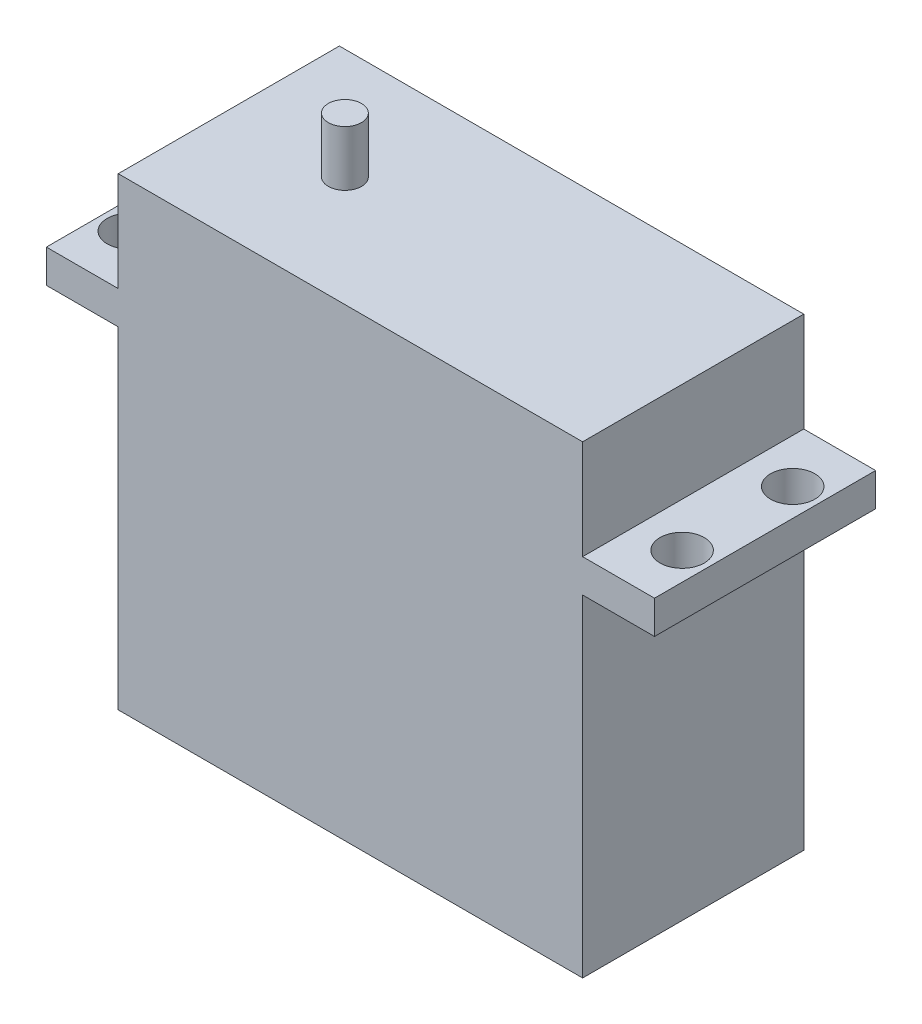
ISO-10303-21;
HEADER;
FILE_DESCRIPTION(('STEP AP214'),'2;1');
FILE_NAME('part.step','',(''),(''),'','','');
FILE_SCHEMA(('AUTOMOTIVE_DESIGN { 1 0 10303 214 1 1 1 1 }'));
ENDSEC;
DATA;
#1=APPLICATION_CONTEXT('core data for automotive mechanical design processes');
#2=APPLICATION_PROTOCOL_DEFINITION('international standard','automotive_design',2000,#1);
#3=PRODUCT_CONTEXT('',#1,'mechanical');
#4=PRODUCT('Part','Part','',(#3));
#5=PRODUCT_RELATED_PRODUCT_CATEGORY('part','',(#4));
#6=PRODUCT_DEFINITION_FORMATION('','',#4);
#7=PRODUCT_DEFINITION_CONTEXT('part definition',#1,'design');
#8=PRODUCT_DEFINITION('design','',#6,#7);
#9=PRODUCT_DEFINITION_SHAPE('','',#8);
#10=(LENGTH_UNIT() NAMED_UNIT(*) SI_UNIT(.MILLI.,.METRE.));
#11=(NAMED_UNIT(*) PLANE_ANGLE_UNIT() SI_UNIT($,.RADIAN.));
#12=(NAMED_UNIT(*) SI_UNIT($,.STERADIAN.) SOLID_ANGLE_UNIT());
#13=UNCERTAINTY_MEASURE_WITH_UNIT(LENGTH_MEASURE(1.E-05),#10,'distance_accuracy_value','');
#14=(GEOMETRIC_REPRESENTATION_CONTEXT(3) GLOBAL_UNCERTAINTY_ASSIGNED_CONTEXT((#13)) GLOBAL_UNIT_ASSIGNED_CONTEXT((#10,
#11,#12)) REPRESENTATION_CONTEXT('',''));
#15=CARTESIAN_POINT('',(0.,0.,0.));
#16=DIRECTION('',(0.,0.,1.));
#17=DIRECTION('',(1.,0.,0.));
#18=AXIS2_PLACEMENT_3D('',#15,#16,#17);
#19=CARTESIAN_POINT('',(48.4999999999999,0.,0.));
#20=DIRECTION('',(1.,0.,0.));
#21=DIRECTION('',(0.,1.,0.));
#22=AXIS2_PLACEMENT_3D('',#19,#20,#21);
#23=PLANE('',#22);
#24=DIRECTION('',(0.,0.,-1.));
#25=VECTOR('',#24,1.);
#26=CARTESIAN_POINT('',(48.5,33.,20.));
#27=LINE('',#26,#25);
#28=CARTESIAN_POINT('',(48.5,33.,20.));
#29=VERTEX_POINT('',#28);
#30=CARTESIAN_POINT('',(48.5,33.,0.));
#31=VERTEX_POINT('',#30);
#32=EDGE_CURVE('E128',#29,#31,#27,.T.);
#33=ORIENTED_EDGE('',*,*,#32,.F.);
#34=DIRECTION('',(0.,1.,0.));
#35=VECTOR('',#34,1.);
#36=CARTESIAN_POINT('',(48.4999999999999,0.,20.));
#37=LINE('',#36,#35);
#38=CARTESIAN_POINT('',(48.5,30.,20.));
#39=VERTEX_POINT('',#38);
#40=EDGE_CURVE('E139',#39,#29,#37,.T.);
#41=ORIENTED_EDGE('',*,*,#40,.F.);
#42=DIRECTION('',(0.,0.,-1.));
#43=VECTOR('',#42,1.);
#44=CARTESIAN_POINT('',(48.5,30.,20.));
#45=LINE('',#44,#43);
#46=CARTESIAN_POINT('',(48.5,30.,0.));
#47=VERTEX_POINT('',#46);
#48=EDGE_CURVE('E198',#39,#47,#45,.T.);
#49=ORIENTED_EDGE('',*,*,#48,.T.);
#50=DIRECTION('',(0.,1.,0.));
#51=VECTOR('',#50,1.);
#52=CARTESIAN_POINT('',(48.4999999999999,0.,0.));
#53=LINE('',#52,#51);
#54=EDGE_CURVE('E141',#47,#31,#53,.T.);
#55=ORIENTED_EDGE('',*,*,#54,.T.);
#56=EDGE_LOOP('',(#33,#41,#49,#55));
#57=FACE_BOUND('',#56,.T.);
#58=ADVANCED_FACE('F35',(#57),#23,.T.);
#59=CARTESIAN_POINT('',(-6.50000000000026,0.,0.));
#60=DIRECTION('',(0.,-1.,0.));
#61=DIRECTION('',(0.,0.,-1.));
#62=AXIS2_PLACEMENT_3D('',#59,#60,#61);
#63=PLANE('',#62);
#64=DIRECTION('',(0.,0.,-1.));
#65=VECTOR('',#64,1.);
#66=CARTESIAN_POINT('',(42.,0.,20.));
#67=LINE('',#66,#65);
#68=CARTESIAN_POINT('',(42.,0.,20.));
#69=VERTEX_POINT('',#68);
#70=CARTESIAN_POINT('',(42.,0.,0.));
#71=VERTEX_POINT('',#70);
#72=EDGE_CURVE('E194',#69,#71,#67,.T.);
#73=ORIENTED_EDGE('',*,*,#72,.F.);
#74=DIRECTION('',(1.,0.,0.));
#75=VECTOR('',#74,1.);
#76=CARTESIAN_POINT('',(-6.50000000000026,0.,20.));
#77=LINE('',#76,#75);
#78=CARTESIAN_POINT('',(0.,0.,20.));
#79=VERTEX_POINT('',#78);
#80=EDGE_CURVE('E157',#79,#69,#77,.T.);
#81=ORIENTED_EDGE('',*,*,#80,.F.);
#82=DIRECTION('',(0.,0.,-1.));
#83=VECTOR('',#82,1.);
#84=CARTESIAN_POINT('',(0.,0.,20.));
#85=LINE('',#84,#83);
#86=CARTESIAN_POINT('',(0.,0.,0.));
#87=VERTEX_POINT('',#86);
#88=EDGE_CURVE('E215',#79,#87,#85,.T.);
#89=ORIENTED_EDGE('',*,*,#88,.T.);
#90=DIRECTION('',(1.,0.,0.));
#91=VECTOR('',#90,1.);
#92=CARTESIAN_POINT('',(-6.50000000000026,0.,0.));
#93=LINE('',#92,#91);
#94=EDGE_CURVE('E11',#87,#71,#93,.T.);
#95=ORIENTED_EDGE('',*,*,#94,.T.);
#96=EDGE_LOOP('',(#73,#81,#89,#95));
#97=FACE_BOUND('',#96,.T.);
#98=ADVANCED_FACE('F276',(#97),#63,.T.);
#99=CARTESIAN_POINT('',(-6.50000000000006,42.,0.));
#100=DIRECTION('',(-1.,0.,0.));
#101=DIRECTION('',(0.,-1.,0.));
#102=AXIS2_PLACEMENT_3D('',#99,#100,#101);
#103=PLANE('',#102);
#104=DIRECTION('',(0.,0.,-1.));
#105=VECTOR('',#104,1.);
#106=CARTESIAN_POINT('',(-6.50000000000013,30.,20.));
#107=LINE('',#106,#105);
#108=CARTESIAN_POINT('',(-6.50000000000013,30.,20.));
#109=VERTEX_POINT('',#108);
#110=CARTESIAN_POINT('',(-6.50000000000013,30.,0.));
#111=VERTEX_POINT('',#110);
#112=EDGE_CURVE('E211',#109,#111,#107,.T.);
#113=ORIENTED_EDGE('',*,*,#112,.F.);
#114=DIRECTION('',(0.,-1.,0.));
#115=VECTOR('',#114,1.);
#116=CARTESIAN_POINT('',(-6.50000000000006,42.,20.));
#117=LINE('',#116,#115);
#118=CARTESIAN_POINT('',(-6.50000000000011,33.,20.));
#119=VERTEX_POINT('',#118);
#120=EDGE_CURVE('E148',#119,#109,#117,.T.);
#121=ORIENTED_EDGE('',*,*,#120,.F.);
#122=DIRECTION('',(0.,0.,-1.));
#123=VECTOR('',#122,1.);
#124=CARTESIAN_POINT('',(-6.50000000000011,33.,20.));
#125=LINE('',#124,#123);
#126=CARTESIAN_POINT('',(-6.50000000000011,33.,0.));
#127=VERTEX_POINT('',#126);
#128=EDGE_CURVE('E146',#119,#127,#125,.T.);
#129=ORIENTED_EDGE('',*,*,#128,.T.);
#130=DIRECTION('',(0.,-1.,0.));
#131=VECTOR('',#130,1.);
#132=CARTESIAN_POINT('',(-6.50000000000006,42.,0.));
#133=LINE('',#132,#131);
#134=EDGE_CURVE('E43',#127,#111,#133,.T.);
#135=ORIENTED_EDGE('',*,*,#134,.T.);
#136=EDGE_LOOP('',(#113,#121,#129,#135));
#137=FACE_BOUND('',#136,.T.);
#138=ADVANCED_FACE('F242',(#137),#103,.T.);
#139=CARTESIAN_POINT('',(48.5,42.,0.));
#140=DIRECTION('',(0.,1.,0.));
#141=DIRECTION('',(0.,0.,1.));
#142=AXIS2_PLACEMENT_3D('',#139,#140,#141);
#143=PLANE('',#142);
#144=DIRECTION('',(0.,0.,-1.));
#145=VECTOR('',#144,1.);
#146=CARTESIAN_POINT('',(42.,42.,20.));
#147=LINE('',#146,#145);
#148=CARTESIAN_POINT('',(42.,42.,20.));
#149=VERTEX_POINT('',#148);
#150=CARTESIAN_POINT('',(42.,42.,0.));
#151=VERTEX_POINT('',#150);
#152=EDGE_CURVE('E185',#149,#151,#147,.T.);
#153=ORIENTED_EDGE('',*,*,#152,.T.);
#154=DIRECTION('',(-1.,0.,0.));
#155=VECTOR('',#154,1.);
#156=CARTESIAN_POINT('',(48.5,42.,0.));
#157=LINE('',#156,#155);
#158=CARTESIAN_POINT('',(0.,42.,0.));
#159=VERTEX_POINT('',#158);
#160=EDGE_CURVE('E237',#151,#159,#157,.T.);
#161=ORIENTED_EDGE('',*,*,#160,.T.);
#162=DIRECTION('',(0.,0.,-1.));
#163=VECTOR('',#162,1.);
#164=CARTESIAN_POINT('',(0.,42.,20.));
#165=LINE('',#164,#163);
#166=CARTESIAN_POINT('',(0.,42.,20.));
#167=VERTEX_POINT('',#166);
#168=EDGE_CURVE('E229',#167,#159,#165,.T.);
#169=ORIENTED_EDGE('',*,*,#168,.F.);
#170=DIRECTION('',(-1.,0.,0.));
#171=VECTOR('',#170,1.);
#172=CARTESIAN_POINT('',(48.5,42.,20.));
#173=LINE('',#172,#171);
#174=EDGE_CURVE('E145',#149,#167,#173,.T.);
#175=ORIENTED_EDGE('',*,*,#174,.F.);
#176=EDGE_LOOP('',(#153,#161,#169,#175));
#177=FACE_BOUND('',#176,.T.);
#178=CARTESIAN_POINT('',(10.5000000000003,42.,10.0000009485004));
#179=DIRECTION('',(0.,1.,0.));
#180=DIRECTION('',(0.,0.,1.));
#181=AXIS2_PLACEMENT_3D('',#178,#179,#180);
#182=CIRCLE('',#181,1.5);
#183=CARTESIAN_POINT('',(10.5000000000003,42.,11.5000009485004));
#184=VERTEX_POINT('',#183);
#185=EDGE_CURVE('E176',#184,#184,#182,.T.);
#186=ORIENTED_EDGE('',*,*,#185,.F.);
#187=EDGE_LOOP('',(#186));
#188=FACE_BOUND('',#187,.T.);
#189=ADVANCED_FACE('F265',(#177,#188),#143,.T.);
#190=CARTESIAN_POINT('',(0.,0.,0.));
#191=DIRECTION('',(0.,0.,1.));
#192=DIRECTION('',(1.,0.,0.));
#193=AXIS2_PLACEMENT_3D('',#190,#191,#192);
#194=PLANE('',#193);
#195=ORIENTED_EDGE('',*,*,#160,.F.);
#196=DIRECTION('',(0.,1.,0.));
#197=VECTOR('',#196,1.);
#198=CARTESIAN_POINT('',(42.,33.,0.));
#199=LINE('',#198,#197);
#200=CARTESIAN_POINT('',(42.,33.,0.));
#201=VERTEX_POINT('',#200);
#202=EDGE_CURVE('E133',#201,#151,#199,.T.);
#203=ORIENTED_EDGE('',*,*,#202,.F.);
#204=DIRECTION('',(-1.,0.,0.));
#205=VECTOR('',#204,1.);
#206=CARTESIAN_POINT('',(48.5,33.,0.));
#207=LINE('',#206,#205);
#208=EDGE_CURVE('E179',#31,#201,#207,.T.);
#209=ORIENTED_EDGE('',*,*,#208,.F.);
#210=ORIENTED_EDGE('',*,*,#54,.F.);
#211=DIRECTION('',(1.,0.,0.));
#212=VECTOR('',#211,1.);
#213=CARTESIAN_POINT('',(42.,30.,0.));
#214=LINE('',#213,#212);
#215=CARTESIAN_POINT('',(42.,30.,0.));
#216=VERTEX_POINT('',#215);
#217=EDGE_CURVE('E192',#216,#47,#214,.T.);
#218=ORIENTED_EDGE('',*,*,#217,.F.);
#219=DIRECTION('',(0.,1.,0.));
#220=VECTOR('',#219,1.);
#221=CARTESIAN_POINT('',(42.,0.,0.));
#222=LINE('',#221,#220);
#223=EDGE_CURVE('E188',#71,#216,#222,.T.);
#224=ORIENTED_EDGE('',*,*,#223,.F.);
#225=ORIENTED_EDGE('',*,*,#94,.F.);
#226=DIRECTION('',(0.,-1.,0.));
#227=VECTOR('',#226,1.);
#228=CARTESIAN_POINT('',(0.,30.,0.));
#229=LINE('',#228,#227);
#230=CARTESIAN_POINT('',(0.,30.,0.));
#231=VERTEX_POINT('',#230);
#232=EDGE_CURVE('E208',#231,#87,#229,.T.);
#233=ORIENTED_EDGE('',*,*,#232,.F.);
#234=DIRECTION('',(1.,0.,0.));
#235=VECTOR('',#234,1.);
#236=CARTESIAN_POINT('',(-6.50000000000013,30.,0.));
#237=LINE('',#236,#235);
#238=EDGE_CURVE('E200',#111,#231,#237,.T.);
#239=ORIENTED_EDGE('',*,*,#238,.F.);
#240=ORIENTED_EDGE('',*,*,#134,.F.);
#241=DIRECTION('',(-1.,0.,0.));
#242=VECTOR('',#241,1.);
#243=CARTESIAN_POINT('',(-1.06685493772574E-13,33.,0.));
#244=LINE('',#243,#242);
#245=CARTESIAN_POINT('',(-1.06685493772574E-13,33.,0.));
#246=VERTEX_POINT('',#245);
#247=EDGE_CURVE('E226',#246,#127,#244,.T.);
#248=ORIENTED_EDGE('',*,*,#247,.F.);
#249=DIRECTION('',(0.,-1.,0.));
#250=VECTOR('',#249,1.);
#251=CARTESIAN_POINT('',(0.,42.,0.));
#252=LINE('',#251,#250);
#253=EDGE_CURVE('E218',#159,#246,#252,.T.);
#254=ORIENTED_EDGE('',*,*,#253,.F.);
#255=EDGE_LOOP('',(#195,#203,#209,#210,#218,#224,#225,#233,#239,#240,#248,#254));
#256=FACE_BOUND('',#255,.T.);
#257=ADVANCED_FACE('F248',(#256),#194,.F.);
#258=CARTESIAN_POINT('',(0.,0.,20.));
#259=DIRECTION('',(0.,0.,1.));
#260=DIRECTION('',(1.,0.,0.));
#261=AXIS2_PLACEMENT_3D('',#258,#259,#260);
#262=PLANE('',#261);
#263=DIRECTION('',(0.,1.,0.));
#264=VECTOR('',#263,1.);
#265=CARTESIAN_POINT('',(42.,33.,20.));
#266=LINE('',#265,#264);
#267=CARTESIAN_POINT('',(42.,33.,20.));
#268=VERTEX_POINT('',#267);
#269=EDGE_CURVE('E51',#268,#149,#266,.T.);
#270=ORIENTED_EDGE('',*,*,#269,.T.);
#271=ORIENTED_EDGE('',*,*,#174,.T.);
#272=DIRECTION('',(0.,-1.,0.));
#273=VECTOR('',#272,1.);
#274=CARTESIAN_POINT('',(0.,42.,20.));
#275=LINE('',#274,#273);
#276=CARTESIAN_POINT('',(3.91180143832771E-13,33.,20.));
#277=VERTEX_POINT('',#276);
#278=EDGE_CURVE('E222',#167,#277,#275,.T.);
#279=ORIENTED_EDGE('',*,*,#278,.T.);
#280=DIRECTION('',(-1.,0.,0.));
#281=VECTOR('',#280,1.);
#282=CARTESIAN_POINT('',(-1.06685493772574E-13,33.,20.));
#283=LINE('',#282,#281);
#284=EDGE_CURVE('E225',#277,#119,#283,.T.);
#285=ORIENTED_EDGE('',*,*,#284,.T.);
#286=ORIENTED_EDGE('',*,*,#120,.T.);
#287=DIRECTION('',(1.,0.,0.));
#288=VECTOR('',#287,1.);
#289=CARTESIAN_POINT('',(-6.50000000000013,30.,20.));
#290=LINE('',#289,#288);
#291=CARTESIAN_POINT('',(0.,30.,20.));
#292=VERTEX_POINT('',#291);
#293=EDGE_CURVE('E204',#109,#292,#290,.T.);
#294=ORIENTED_EDGE('',*,*,#293,.T.);
#295=DIRECTION('',(0.,-1.,0.));
#296=VECTOR('',#295,1.);
#297=CARTESIAN_POINT('',(0.,30.,20.));
#298=LINE('',#297,#296);
#299=EDGE_CURVE('E207',#292,#79,#298,.T.);
#300=ORIENTED_EDGE('',*,*,#299,.T.);
#301=ORIENTED_EDGE('',*,*,#80,.T.);
#302=DIRECTION('',(0.,1.,0.));
#303=VECTOR('',#302,1.);
#304=CARTESIAN_POINT('',(42.,0.,20.));
#305=LINE('',#304,#303);
#306=CARTESIAN_POINT('',(42.,30.,20.));
#307=VERTEX_POINT('',#306);
#308=EDGE_CURVE('E190',#69,#307,#305,.T.);
#309=ORIENTED_EDGE('',*,*,#308,.T.);
#310=DIRECTION('',(1.,0.,0.));
#311=VECTOR('',#310,1.);
#312=CARTESIAN_POINT('',(42.,30.,20.));
#313=LINE('',#312,#311);
#314=EDGE_CURVE('E59',#307,#39,#313,.T.);
#315=ORIENTED_EDGE('',*,*,#314,.T.);
#316=ORIENTED_EDGE('',*,*,#40,.T.);
#317=DIRECTION('',(-1.,0.,0.));
#318=VECTOR('',#317,1.);
#319=CARTESIAN_POINT('',(48.5,33.,20.));
#320=LINE('',#319,#318);
#321=EDGE_CURVE('E124',#29,#268,#320,.T.);
#322=ORIENTED_EDGE('',*,*,#321,.T.);
#323=EDGE_LOOP('',(#270,#271,#279,#285,#286,#294,#300,#301,#309,#315,#316,#322));
#324=FACE_BOUND('',#323,.T.);
#325=ADVANCED_FACE('F143',(#324),#262,.T.);
#326=CARTESIAN_POINT('',(-1.06685493772574E-13,33.,20.));
#327=DIRECTION('',(0.,-1.,0.));
#328=DIRECTION('',(0.,0.,-1.));
#329=AXIS2_PLACEMENT_3D('',#326,#327,#328);
#330=PLANE('',#329);
#331=CARTESIAN_POINT('',(-4.,33.,15.0000008087871));
#332=DIRECTION('',(0.,1.,0.));
#333=DIRECTION('',(0.,0.,1.));
#334=AXIS2_PLACEMENT_3D('',#331,#332,#333);
#335=CIRCLE('',#334,2.);
#336=CARTESIAN_POINT('',(-4.,33.,17.0000008087871));
#337=VERTEX_POINT('',#336);
#338=EDGE_CURVE('E317',#337,#337,#335,.T.);
#339=ORIENTED_EDGE('',*,*,#338,.F.);
#340=EDGE_LOOP('',(#339));
#341=FACE_BOUND('',#340,.T.);
#342=CARTESIAN_POINT('',(-4.00000000000004,33.,5.00000080878715));
#343=DIRECTION('',(0.,1.,0.));
#344=DIRECTION('',(0.,0.,1.));
#345=AXIS2_PLACEMENT_3D('',#342,#343,#344);
#346=CIRCLE('',#345,2.);
#347=CARTESIAN_POINT('',(-4.00000000000004,33.,7.00000080878715));
#348=VERTEX_POINT('',#347);
#349=EDGE_CURVE('E320',#348,#348,#346,.T.);
#350=ORIENTED_EDGE('',*,*,#349,.F.);
#351=EDGE_LOOP('',(#350));
#352=FACE_BOUND('',#351,.T.);
#353=ORIENTED_EDGE('',*,*,#247,.T.);
#354=ORIENTED_EDGE('',*,*,#128,.F.);
#355=ORIENTED_EDGE('',*,*,#284,.F.);
#356=DIRECTION('',(0.,0.,-1.));
#357=VECTOR('',#356,1.);
#358=CARTESIAN_POINT('',(-1.06685493772574E-13,33.,20.));
#359=LINE('',#358,#357);
#360=EDGE_CURVE('E151',#277,#246,#359,.T.);
#361=ORIENTED_EDGE('',*,*,#360,.T.);
#362=EDGE_LOOP('',(#353,#354,#355,#361));
#363=FACE_BOUND('',#362,.T.);
#364=ADVANCED_FACE('F259',(#341,#352,#363),#330,.F.);
#365=CARTESIAN_POINT('',(0.,42.,20.));
#366=DIRECTION('',(1.,0.,0.));
#367=DIRECTION('',(0.,1.,0.));
#368=AXIS2_PLACEMENT_3D('',#365,#366,#367);
#369=PLANE('',#368);
#370=ORIENTED_EDGE('',*,*,#253,.T.);
#371=ORIENTED_EDGE('',*,*,#360,.F.);
#372=ORIENTED_EDGE('',*,*,#278,.F.);
#373=ORIENTED_EDGE('',*,*,#168,.T.);
#374=EDGE_LOOP('',(#370,#371,#372,#373));
#375=FACE_BOUND('',#374,.T.);
#376=ADVANCED_FACE('F261',(#375),#369,.F.);
#377=CARTESIAN_POINT('',(0.,30.,20.));
#378=DIRECTION('',(1.,0.,0.));
#379=DIRECTION('',(0.,0.,-1.));
#380=AXIS2_PLACEMENT_3D('',#377,#378,#379);
#381=PLANE('',#380);
#382=ORIENTED_EDGE('',*,*,#232,.T.);
#383=ORIENTED_EDGE('',*,*,#88,.F.);
#384=ORIENTED_EDGE('',*,*,#299,.F.);
#385=DIRECTION('',(0.,0.,-1.));
#386=VECTOR('',#385,1.);
#387=CARTESIAN_POINT('',(0.,30.,20.));
#388=LINE('',#387,#386);
#389=EDGE_CURVE('E219',#292,#231,#388,.T.);
#390=ORIENTED_EDGE('',*,*,#389,.T.);
#391=EDGE_LOOP('',(#382,#383,#384,#390));
#392=FACE_BOUND('',#391,.T.);
#393=ADVANCED_FACE('F278',(#392),#381,.F.);
#394=CARTESIAN_POINT('',(-6.50000000000013,30.,20.));
#395=DIRECTION('',(0.,1.,0.));
#396=DIRECTION('',(0.,0.,1.));
#397=AXIS2_PLACEMENT_3D('',#394,#395,#396);
#398=PLANE('',#397);
#399=CARTESIAN_POINT('',(-4.,30.,15.0000008087871));
#400=DIRECTION('',(0.,1.,0.));
#401=DIRECTION('',(0.,0.,1.));
#402=AXIS2_PLACEMENT_3D('',#399,#400,#401);
#403=CIRCLE('',#402,2.);
#404=CARTESIAN_POINT('',(-4.,30.,17.0000008087871));
#405=VERTEX_POINT('',#404);
#406=EDGE_CURVE('E38',#405,#405,#403,.T.);
#407=ORIENTED_EDGE('',*,*,#406,.T.);
#408=EDGE_LOOP('',(#407));
#409=FACE_BOUND('',#408,.T.);
#410=CARTESIAN_POINT('',(-4.00000000000004,30.,5.00000080878715));
#411=DIRECTION('',(0.,1.,0.));
#412=DIRECTION('',(0.,0.,1.));
#413=AXIS2_PLACEMENT_3D('',#410,#411,#412);
#414=CIRCLE('',#413,2.);
#415=CARTESIAN_POINT('',(-4.00000000000004,30.,7.00000080878715));
#416=VERTEX_POINT('',#415);
#417=EDGE_CURVE('E159',#416,#416,#414,.T.);
#418=ORIENTED_EDGE('',*,*,#417,.T.);
#419=EDGE_LOOP('',(#418));
#420=FACE_BOUND('',#419,.T.);
#421=ORIENTED_EDGE('',*,*,#238,.T.);
#422=ORIENTED_EDGE('',*,*,#389,.F.);
#423=ORIENTED_EDGE('',*,*,#293,.F.);
#424=ORIENTED_EDGE('',*,*,#112,.T.);
#425=EDGE_LOOP('',(#421,#422,#423,#424));
#426=FACE_BOUND('',#425,.T.);
#427=ADVANCED_FACE('F254',(#409,#420,#426),#398,.F.);
#428=CARTESIAN_POINT('',(42.,30.,20.));
#429=DIRECTION('',(0.,1.,0.));
#430=DIRECTION('',(0.,0.,1.));
#431=AXIS2_PLACEMENT_3D('',#428,#429,#430);
#432=PLANE('',#431);
#433=CARTESIAN_POINT('',(46.,30.,5.0000008087868));
#434=DIRECTION('',(0.,1.,0.));
#435=DIRECTION('',(0.,0.,1.));
#436=AXIS2_PLACEMENT_3D('',#433,#434,#435);
#437=CIRCLE('',#436,2.);
#438=CARTESIAN_POINT('',(46.,30.,7.0000008087868));
#439=VERTEX_POINT('',#438);
#440=EDGE_CURVE('E161',#439,#439,#437,.T.);
#441=ORIENTED_EDGE('',*,*,#440,.T.);
#442=EDGE_LOOP('',(#441));
#443=FACE_BOUND('',#442,.T.);
#444=CARTESIAN_POINT('',(46.,30.,15.0000008087868));
#445=DIRECTION('',(0.,1.,0.));
#446=DIRECTION('',(0.,0.,1.));
#447=AXIS2_PLACEMENT_3D('',#444,#445,#446);
#448=CIRCLE('',#447,2.);
#449=CARTESIAN_POINT('',(46.,30.,17.0000008087868));
#450=VERTEX_POINT('',#449);
#451=EDGE_CURVE('E167',#450,#450,#448,.T.);
#452=ORIENTED_EDGE('',*,*,#451,.T.);
#453=EDGE_LOOP('',(#452));
#454=FACE_BOUND('',#453,.T.);
#455=ORIENTED_EDGE('',*,*,#217,.T.);
#456=ORIENTED_EDGE('',*,*,#48,.F.);
#457=ORIENTED_EDGE('',*,*,#314,.F.);
#458=DIRECTION('',(0.,0.,-1.));
#459=VECTOR('',#458,1.);
#460=CARTESIAN_POINT('',(42.,30.,20.));
#461=LINE('',#460,#459);
#462=EDGE_CURVE('E201',#307,#216,#461,.T.);
#463=ORIENTED_EDGE('',*,*,#462,.T.);
#464=EDGE_LOOP('',(#455,#456,#457,#463));
#465=FACE_BOUND('',#464,.T.);
#466=ADVANCED_FACE('F271',(#443,#454,#465),#432,.F.);
#467=CARTESIAN_POINT('',(42.,0.,20.));
#468=DIRECTION('',(-1.,0.,0.));
#469=DIRECTION('',(0.,0.,1.));
#470=AXIS2_PLACEMENT_3D('',#467,#468,#469);
#471=PLANE('',#470);
#472=ORIENTED_EDGE('',*,*,#223,.T.);
#473=ORIENTED_EDGE('',*,*,#462,.F.);
#474=ORIENTED_EDGE('',*,*,#308,.F.);
#475=ORIENTED_EDGE('',*,*,#72,.T.);
#476=EDGE_LOOP('',(#472,#473,#474,#475));
#477=FACE_BOUND('',#476,.T.);
#478=ADVANCED_FACE('F273',(#477),#471,.F.);
#479=CARTESIAN_POINT('',(42.,33.,20.));
#480=DIRECTION('',(-1.,0.,0.));
#481=DIRECTION('',(0.,0.,1.));
#482=AXIS2_PLACEMENT_3D('',#479,#480,#481);
#483=PLANE('',#482);
#484=ORIENTED_EDGE('',*,*,#202,.T.);
#485=ORIENTED_EDGE('',*,*,#152,.F.);
#486=ORIENTED_EDGE('',*,*,#269,.F.);
#487=DIRECTION('',(0.,0.,-1.));
#488=VECTOR('',#487,1.);
#489=CARTESIAN_POINT('',(42.,33.,20.));
#490=LINE('',#489,#488);
#491=EDGE_CURVE('E130',#268,#201,#490,.T.);
#492=ORIENTED_EDGE('',*,*,#491,.T.);
#493=EDGE_LOOP('',(#484,#485,#486,#492));
#494=FACE_BOUND('',#493,.T.);
#495=ADVANCED_FACE('F268',(#494),#483,.F.);
#496=CARTESIAN_POINT('',(48.5,33.,20.));
#497=DIRECTION('',(0.,-1.,0.));
#498=DIRECTION('',(0.,0.,-1.));
#499=AXIS2_PLACEMENT_3D('',#496,#497,#498);
#500=PLANE('',#499);
#501=CARTESIAN_POINT('',(46.,33.,5.0000008087868));
#502=DIRECTION('',(0.,1.,0.));
#503=DIRECTION('',(0.,0.,1.));
#504=AXIS2_PLACEMENT_3D('',#501,#502,#503);
#505=CIRCLE('',#504,2.);
#506=CARTESIAN_POINT('',(46.,33.,7.0000008087868));
#507=VERTEX_POINT('',#506);
#508=EDGE_CURVE('E322',#507,#507,#505,.T.);
#509=ORIENTED_EDGE('',*,*,#508,.F.);
#510=EDGE_LOOP('',(#509));
#511=FACE_BOUND('',#510,.T.);
#512=CARTESIAN_POINT('',(46.,33.,15.0000008087868));
#513=DIRECTION('',(0.,1.,0.));
#514=DIRECTION('',(0.,0.,1.));
#515=AXIS2_PLACEMENT_3D('',#512,#513,#514);
#516=CIRCLE('',#515,2.);
#517=CARTESIAN_POINT('',(46.,33.,17.0000008087868));
#518=VERTEX_POINT('',#517);
#519=EDGE_CURVE('E172',#518,#518,#516,.T.);
#520=ORIENTED_EDGE('',*,*,#519,.F.);
#521=EDGE_LOOP('',(#520));
#522=FACE_BOUND('',#521,.T.);
#523=ORIENTED_EDGE('',*,*,#208,.T.);
#524=ORIENTED_EDGE('',*,*,#491,.F.);
#525=ORIENTED_EDGE('',*,*,#321,.F.);
#526=ORIENTED_EDGE('',*,*,#32,.T.);
#527=EDGE_LOOP('',(#523,#524,#525,#526));
#528=FACE_BOUND('',#527,.T.);
#529=ADVANCED_FACE('F127',(#511,#522,#528),#500,.F.);
#530=CARTESIAN_POINT('',(10.5000000000003,42.,10.0000009485004));
#531=DIRECTION('',(0.,1.,0.));
#532=DIRECTION('',(0.,0.,1.));
#533=AXIS2_PLACEMENT_3D('',#530,#531,#532);
#534=CYLINDRICAL_SURFACE('',#533,1.5);
#535=ORIENTED_EDGE('',*,*,#185,.T.);
#536=EDGE_LOOP('',(#535));
#537=FACE_BOUND('',#536,.T.);
#538=CARTESIAN_POINT('',(10.5000000000003,47.,10.0000009485004));
#539=DIRECTION('',(0.,1.,0.));
#540=DIRECTION('',(0.,0.,1.));
#541=AXIS2_PLACEMENT_3D('',#538,#539,#540);
#542=CIRCLE('',#541,1.5);
#543=CARTESIAN_POINT('',(10.5000000000003,47.,11.5000009485004));
#544=VERTEX_POINT('',#543);
#545=EDGE_CURVE('E165',#544,#544,#542,.T.);
#546=ORIENTED_EDGE('',*,*,#545,.F.);
#547=EDGE_LOOP('',(#546));
#548=FACE_BOUND('',#547,.T.);
#549=ADVANCED_FACE('F334',(#537,#548),#534,.T.);
#550=CARTESIAN_POINT('',(10.5000000000003,47.,10.0000009485004));
#551=DIRECTION('',(0.,1.,0.));
#552=DIRECTION('',(0.,0.,1.));
#553=AXIS2_PLACEMENT_3D('',#550,#551,#552);
#554=PLANE('',#553);
#555=ORIENTED_EDGE('',*,*,#545,.T.);
#556=EDGE_LOOP('',(#555));
#557=FACE_BOUND('',#556,.T.);
#558=ADVANCED_FACE('F342',(#557),#554,.T.);
#559=CARTESIAN_POINT('',(46.,28.,15.0000008087868));
#560=DIRECTION('',(0.,1.,0.));
#561=DIRECTION('',(0.,0.,1.));
#562=AXIS2_PLACEMENT_3D('',#559,#560,#561);
#563=CYLINDRICAL_SURFACE('',#562,2.);
#564=ORIENTED_EDGE('',*,*,#519,.T.);
#565=EDGE_LOOP('',(#564));
#566=FACE_BOUND('',#565,.T.);
#567=ORIENTED_EDGE('',*,*,#451,.F.);
#568=EDGE_LOOP('',(#567));
#569=FACE_BOUND('',#568,.T.);
#570=ADVANCED_FACE('F330',(#566,#569),#563,.F.);
#571=CARTESIAN_POINT('',(46.,28.,5.0000008087868));
#572=DIRECTION('',(0.,1.,0.));
#573=DIRECTION('',(0.,0.,1.));
#574=AXIS2_PLACEMENT_3D('',#571,#572,#573);
#575=CYLINDRICAL_SURFACE('',#574,2.);
#576=ORIENTED_EDGE('',*,*,#508,.T.);
#577=EDGE_LOOP('',(#576));
#578=FACE_BOUND('',#577,.T.);
#579=ORIENTED_EDGE('',*,*,#440,.F.);
#580=EDGE_LOOP('',(#579));
#581=FACE_BOUND('',#580,.T.);
#582=ADVANCED_FACE('F379',(#578,#581),#575,.F.);
#583=CARTESIAN_POINT('',(-4.00000000000004,28.,5.00000080878715));
#584=DIRECTION('',(0.,1.,0.));
#585=DIRECTION('',(0.,0.,1.));
#586=AXIS2_PLACEMENT_3D('',#583,#584,#585);
#587=CYLINDRICAL_SURFACE('',#586,2.);
#588=ORIENTED_EDGE('',*,*,#349,.T.);
#589=EDGE_LOOP('',(#588));
#590=FACE_BOUND('',#589,.T.);
#591=ORIENTED_EDGE('',*,*,#417,.F.);
#592=EDGE_LOOP('',(#591));
#593=FACE_BOUND('',#592,.T.);
#594=ADVANCED_FACE('F386',(#590,#593),#587,.F.);
#595=CARTESIAN_POINT('',(-4.,28.,15.0000008087871));
#596=DIRECTION('',(0.,1.,0.));
#597=DIRECTION('',(0.,0.,1.));
#598=AXIS2_PLACEMENT_3D('',#595,#596,#597);
#599=CYLINDRICAL_SURFACE('',#598,2.);
#600=ORIENTED_EDGE('',*,*,#338,.T.);
#601=EDGE_LOOP('',(#600));
#602=FACE_BOUND('',#601,.T.);
#603=ORIENTED_EDGE('',*,*,#406,.F.);
#604=EDGE_LOOP('',(#603));
#605=FACE_BOUND('',#604,.T.);
#606=ADVANCED_FACE('F394',(#602,#605),#599,.F.);
#607=CLOSED_SHELL('',(#58,#98,#138,#189,#257,#325,#364,#376,#393,#427,#466,#478,#495,#529,#549,
#558,#570,#582,#594,#606));
#608=MANIFOLD_SOLID_BREP('B2',#607);
#609=ADVANCED_BREP_SHAPE_REPRESENTATION('',(#18,#608),#14);
#610=SHAPE_DEFINITION_REPRESENTATION(#9,#609);
ENDSEC;
END-ISO-10303-21;
